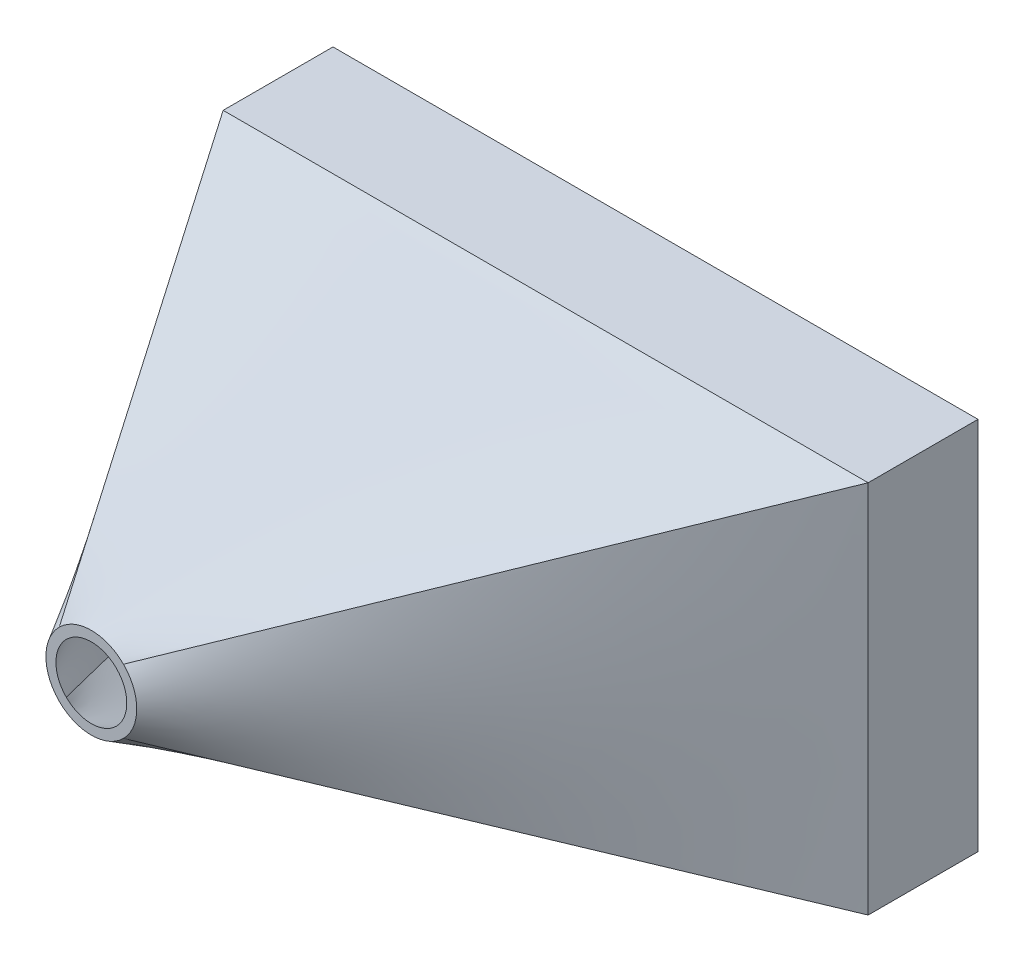
ISO-10303-21;
HEADER;
FILE_DESCRIPTION(('STEP AP214'),'2;1');
FILE_NAME('part.step','',(''),(''),'','','');
FILE_SCHEMA(('AUTOMOTIVE_DESIGN { 1 0 10303 214 1 1 1 1 }'));
ENDSEC;
DATA;
#1=APPLICATION_CONTEXT('core data for automotive mechanical design processes');
#2=APPLICATION_PROTOCOL_DEFINITION('international standard','automotive_design',2000,#1);
#3=PRODUCT_CONTEXT('',#1,'mechanical');
#4=PRODUCT('Part','Part','',(#3));
#5=PRODUCT_RELATED_PRODUCT_CATEGORY('part','',(#4));
#6=PRODUCT_DEFINITION_FORMATION('','',#4);
#7=PRODUCT_DEFINITION_CONTEXT('part definition',#1,'design');
#8=PRODUCT_DEFINITION('design','',#6,#7);
#9=PRODUCT_DEFINITION_SHAPE('','',#8);
#10=(LENGTH_UNIT() NAMED_UNIT(*) SI_UNIT(.MILLI.,.METRE.));
#11=(NAMED_UNIT(*) PLANE_ANGLE_UNIT() SI_UNIT($,.RADIAN.));
#12=(NAMED_UNIT(*) SI_UNIT($,.STERADIAN.) SOLID_ANGLE_UNIT());
#13=UNCERTAINTY_MEASURE_WITH_UNIT(LENGTH_MEASURE(1.E-05),#10,'distance_accuracy_value','');
#14=(GEOMETRIC_REPRESENTATION_CONTEXT(3) GLOBAL_UNCERTAINTY_ASSIGNED_CONTEXT((#13)) GLOBAL_UNIT_ASSIGNED_CONTEXT((#10,
#11,#12)) REPRESENTATION_CONTEXT('',''));
#15=CARTESIAN_POINT('',(0.,0.,0.));
#16=DIRECTION('',(0.,0.,1.));
#17=DIRECTION('',(1.,0.,0.));
#18=AXIS2_PLACEMENT_3D('',#15,#16,#17);
#19=CARTESIAN_POINT('',(-64.6,-37.5,22.));
#20=DIRECTION('',(0.,1.,0.));
#21=DIRECTION('',(0.,0.,1.));
#22=AXIS2_PLACEMENT_3D('',#19,#20,#21);
#23=PLANE('',#22);
#24=DIRECTION('',(1.,0.,0.));
#25=VECTOR('',#24,1.);
#26=CARTESIAN_POINT('',(-64.6,-37.5,0.));
#27=LINE('',#26,#25);
#28=CARTESIAN_POINT('',(-64.6,-37.5,0.));
#29=VERTEX_POINT('',#28);
#30=CARTESIAN_POINT('',(-62.6,-37.5,0.));
#31=VERTEX_POINT('',#30);
#32=EDGE_CURVE('E232',#29,#31,#27,.T.);
#33=ORIENTED_EDGE('',*,*,#32,.T.);
#34=DIRECTION('',(0.,0.,1.));
#35=VECTOR('',#34,1.);
#36=CARTESIAN_POINT('',(-62.6,-37.5,22.));
#37=LINE('',#36,#35);
#38=CARTESIAN_POINT('',(-62.6,-37.5,22.));
#39=VERTEX_POINT('',#38);
#40=EDGE_CURVE('E466',#31,#39,#37,.T.);
#41=ORIENTED_EDGE('',*,*,#40,.T.);
#42=DIRECTION('',(1.,0.,0.));
#43=VECTOR('',#42,1.);
#44=CARTESIAN_POINT('',(-64.6,-37.5,22.));
#45=LINE('',#44,#43);
#46=CARTESIAN_POINT('',(-64.6,-37.5,22.));
#47=VERTEX_POINT('',#46);
#48=EDGE_CURVE('E324',#47,#39,#45,.T.);
#49=ORIENTED_EDGE('',*,*,#48,.F.);
#50=DIRECTION('',(0.,0.,-1.));
#51=VECTOR('',#50,1.);
#52=CARTESIAN_POINT('',(-64.6,-37.5,22.));
#53=LINE('',#52,#51);
#54=EDGE_CURVE('E228',#47,#29,#53,.T.);
#55=ORIENTED_EDGE('',*,*,#54,.T.);
#56=EDGE_LOOP('',(#33,#41,#49,#55));
#57=FACE_BOUND('',#56,.T.);
#58=ADVANCED_FACE('F111',(#57),#23,.F.);
#59=CARTESIAN_POINT('',(0.,0.,0.));
#60=DIRECTION('',(0.,0.,1.));
#61=DIRECTION('',(1.,0.,0.));
#62=AXIS2_PLACEMENT_3D('',#59,#60,#61);
#63=PLANE('',#62);
#64=DIRECTION('',(0.,-1.,0.));
#65=VECTOR('',#64,1.);
#66=CARTESIAN_POINT('',(-62.6,35.5,0.));
#67=LINE('',#66,#65);
#68=CARTESIAN_POINT('',(-62.6,35.5,0.));
#69=VERTEX_POINT('',#68);
#70=EDGE_CURVE('E173',#69,#31,#67,.T.);
#71=ORIENTED_EDGE('',*,*,#70,.T.);
#72=ORIENTED_EDGE('',*,*,#32,.F.);
#73=DIRECTION('',(0.,-1.,0.));
#74=VECTOR('',#73,1.);
#75=CARTESIAN_POINT('',(-64.6,37.5,0.));
#76=LINE('',#75,#74);
#77=CARTESIAN_POINT('',(-64.6,37.5,0.));
#78=VERTEX_POINT('',#77);
#79=EDGE_CURVE('E219',#78,#29,#76,.T.);
#80=ORIENTED_EDGE('',*,*,#79,.F.);
#81=DIRECTION('',(-1.,0.,0.));
#82=VECTOR('',#81,1.);
#83=CARTESIAN_POINT('',(-64.6,37.5,0.));
#84=LINE('',#83,#82);
#85=CARTESIAN_POINT('',(64.6,37.5,0.));
#86=VERTEX_POINT('',#85);
#87=EDGE_CURVE('E210',#86,#78,#84,.T.);
#88=ORIENTED_EDGE('',*,*,#87,.F.);
#89=DIRECTION('',(0.,1.,0.));
#90=VECTOR('',#89,1.);
#91=CARTESIAN_POINT('',(64.6,37.5,0.));
#92=LINE('',#91,#90);
#93=CARTESIAN_POINT('',(64.6,-37.5,0.));
#94=VERTEX_POINT('',#93);
#95=EDGE_CURVE('E220',#94,#86,#92,.T.);
#96=ORIENTED_EDGE('',*,*,#95,.F.);
#97=CARTESIAN_POINT('',(62.6,-37.5,0.));
#98=VERTEX_POINT('',#97);
#99=EDGE_CURVE('E130',#98,#94,#27,.T.);
#100=ORIENTED_EDGE('',*,*,#99,.F.);
#101=DIRECTION('',(0.,1.,0.));
#102=VECTOR('',#101,1.);
#103=CARTESIAN_POINT('',(62.6,35.5,0.));
#104=LINE('',#103,#102);
#105=CARTESIAN_POINT('',(62.6,35.5,0.));
#106=VERTEX_POINT('',#105);
#107=EDGE_CURVE('E494',#98,#106,#104,.T.);
#108=ORIENTED_EDGE('',*,*,#107,.T.);
#109=DIRECTION('',(-1.,0.,0.));
#110=VECTOR('',#109,1.);
#111=CARTESIAN_POINT('',(-62.6,35.5,0.));
#112=LINE('',#111,#110);
#113=EDGE_CURVE('E493',#106,#69,#112,.T.);
#114=ORIENTED_EDGE('',*,*,#113,.T.);
#115=EDGE_LOOP('',(#71,#72,#80,#88,#96,#100,#108,#114));
#116=FACE_BOUND('',#115,.T.);
#117=ADVANCED_FACE('F230',(#116),#63,.F.);
#118=CARTESIAN_POINT('',(64.6,37.5,22.));
#119=DIRECTION('',(-1.,0.,0.));
#120=DIRECTION('',(0.,0.,1.));
#121=AXIS2_PLACEMENT_3D('',#118,#119,#120);
#122=PLANE('',#121);
#123=ORIENTED_EDGE('',*,*,#95,.T.);
#124=DIRECTION('',(0.,0.,-1.));
#125=VECTOR('',#124,1.);
#126=CARTESIAN_POINT('',(64.6,37.5,22.));
#127=LINE('',#126,#125);
#128=CARTESIAN_POINT('',(64.6,37.5,22.));
#129=VERTEX_POINT('',#128);
#130=EDGE_CURVE('E12',#129,#86,#127,.T.);
#131=ORIENTED_EDGE('',*,*,#130,.F.);
#132=DIRECTION('',(0.,1.,0.));
#133=VECTOR('',#132,1.);
#134=CARTESIAN_POINT('',(64.6,37.5,22.));
#135=LINE('',#134,#133);
#136=CARTESIAN_POINT('',(64.6,-37.5,22.));
#137=VERTEX_POINT('',#136);
#138=EDGE_CURVE('E163',#137,#129,#135,.T.);
#139=ORIENTED_EDGE('',*,*,#138,.F.);
#140=DIRECTION('',(0.,0.,-1.));
#141=VECTOR('',#140,1.);
#142=CARTESIAN_POINT('',(64.6,-37.5,22.));
#143=LINE('',#142,#141);
#144=EDGE_CURVE('E403',#137,#94,#143,.T.);
#145=ORIENTED_EDGE('',*,*,#144,.T.);
#146=EDGE_LOOP('',(#123,#131,#139,#145));
#147=FACE_BOUND('',#146,.T.);
#148=ADVANCED_FACE('F113',(#147),#122,.F.);
#149=CARTESIAN_POINT('',(-64.6,37.5,22.));
#150=DIRECTION('',(0.,-1.,0.));
#151=DIRECTION('',(0.,0.,-1.));
#152=AXIS2_PLACEMENT_3D('',#149,#150,#151);
#153=PLANE('',#152);
#154=ORIENTED_EDGE('',*,*,#87,.T.);
#155=DIRECTION('',(0.,0.,-1.));
#156=VECTOR('',#155,1.);
#157=CARTESIAN_POINT('',(-64.6,37.5,22.));
#158=LINE('',#157,#156);
#159=CARTESIAN_POINT('',(-64.6,37.5,22.));
#160=VERTEX_POINT('',#159);
#161=EDGE_CURVE('E121',#160,#78,#158,.T.);
#162=ORIENTED_EDGE('',*,*,#161,.F.);
#163=DIRECTION('',(1.,0.,0.));
#164=VECTOR('',#163,1.);
#165=CARTESIAN_POINT('',(-64.6,37.5,22.));
#166=LINE('',#165,#164);
#167=EDGE_CURVE('E237',#129,#160,#166,.F.);
#168=ORIENTED_EDGE('',*,*,#167,.F.);
#169=ORIENTED_EDGE('',*,*,#130,.T.);
#170=EDGE_LOOP('',(#154,#162,#168,#169));
#171=FACE_BOUND('',#170,.T.);
#172=ADVANCED_FACE('F212',(#171),#153,.F.);
#173=CARTESIAN_POINT('',(-64.6,37.5,22.));
#174=DIRECTION('',(1.,0.,0.));
#175=DIRECTION('',(0.,1.,0.));
#176=AXIS2_PLACEMENT_3D('',#173,#174,#175);
#177=PLANE('',#176);
#178=ORIENTED_EDGE('',*,*,#79,.T.);
#179=ORIENTED_EDGE('',*,*,#54,.F.);
#180=DIRECTION('',(0.,1.,0.));
#181=VECTOR('',#180,1.);
#182=CARTESIAN_POINT('',(-64.6,37.5,22.));
#183=LINE('',#182,#181);
#184=EDGE_CURVE('E227',#160,#47,#183,.F.);
#185=ORIENTED_EDGE('',*,*,#184,.F.);
#186=ORIENTED_EDGE('',*,*,#161,.T.);
#187=EDGE_LOOP('',(#178,#179,#185,#186));
#188=FACE_BOUND('',#187,.T.);
#189=ADVANCED_FACE('F223',(#188),#177,.F.);
#190=CARTESIAN_POINT('',(62.6,-37.5,22.));
#191=VERTEX_POINT('',#190);
#192=EDGE_CURVE('E402',#191,#137,#45,.T.);
#193=ORIENTED_EDGE('',*,*,#192,.F.);
#194=DIRECTION('',(0.,0.,-1.));
#195=VECTOR('',#194,1.);
#196=CARTESIAN_POINT('',(62.6,-37.5,22.));
#197=LINE('',#196,#195);
#198=EDGE_CURVE('E502',#191,#98,#197,.T.);
#199=ORIENTED_EDGE('',*,*,#198,.T.);
#200=ORIENTED_EDGE('',*,*,#99,.T.);
#201=ORIENTED_EDGE('',*,*,#144,.F.);
#202=EDGE_LOOP('',(#193,#199,#200,#201));
#203=FACE_BOUND('',#202,.T.);
#204=ADVANCED_FACE('F490',(#203),#23,.F.);
#205=CARTESIAN_POINT('',(62.6,35.5,22.));
#206=DIRECTION('',(-1.,0.,0.));
#207=DIRECTION('',(0.,0.,1.));
#208=AXIS2_PLACEMENT_3D('',#205,#206,#207);
#209=PLANE('',#208);
#210=ORIENTED_EDGE('',*,*,#107,.F.);
#211=ORIENTED_EDGE('',*,*,#198,.F.);
#212=DIRECTION('',(0.,1.,0.));
#213=VECTOR('',#212,1.);
#214=CARTESIAN_POINT('',(62.6,-45.5,22.));
#215=LINE('',#214,#213);
#216=CARTESIAN_POINT('',(62.6,-35.5,22.));
#217=VERTEX_POINT('',#216);
#218=EDGE_CURVE('E568',#191,#217,#215,.T.);
#219=ORIENTED_EDGE('',*,*,#218,.T.);
#220=DIRECTION('',(0.,1.,0.));
#221=VECTOR('',#220,1.);
#222=CARTESIAN_POINT('',(62.6,35.5,22.));
#223=LINE('',#222,#221);
#224=CARTESIAN_POINT('',(62.6,35.5,22.));
#225=VERTEX_POINT('',#224);
#226=EDGE_CURVE('E115',#217,#225,#223,.T.);
#227=ORIENTED_EDGE('',*,*,#226,.T.);
#228=DIRECTION('',(0.,0.,-1.));
#229=VECTOR('',#228,1.);
#230=CARTESIAN_POINT('',(62.6,35.5,22.));
#231=LINE('',#230,#229);
#232=EDGE_CURVE('E241',#225,#106,#231,.T.);
#233=ORIENTED_EDGE('',*,*,#232,.T.);
#234=EDGE_LOOP('',(#210,#211,#219,#227,#233));
#235=FACE_BOUND('',#234,.T.);
#236=ADVANCED_FACE('F569',(#235),#209,.T.);
#237=CARTESIAN_POINT('',(-62.6,35.5,22.));
#238=DIRECTION('',(0.,-1.,0.));
#239=DIRECTION('',(0.,0.,-1.));
#240=AXIS2_PLACEMENT_3D('',#237,#238,#239);
#241=PLANE('',#240);
#242=ORIENTED_EDGE('',*,*,#113,.F.);
#243=ORIENTED_EDGE('',*,*,#232,.F.);
#244=DIRECTION('',(1.,0.,0.));
#245=VECTOR('',#244,1.);
#246=CARTESIAN_POINT('',(-62.6,35.5,22.));
#247=LINE('',#246,#245);
#248=CARTESIAN_POINT('',(-62.6,35.5,22.));
#249=VERTEX_POINT('',#248);
#250=EDGE_CURVE('E460',#225,#249,#247,.F.);
#251=ORIENTED_EDGE('',*,*,#250,.T.);
#252=DIRECTION('',(0.,0.,-1.));
#253=VECTOR('',#252,1.);
#254=CARTESIAN_POINT('',(-62.6,35.5,22.));
#255=LINE('',#254,#253);
#256=EDGE_CURVE('E240',#249,#69,#255,.T.);
#257=ORIENTED_EDGE('',*,*,#256,.T.);
#258=EDGE_LOOP('',(#242,#243,#251,#257));
#259=FACE_BOUND('',#258,.T.);
#260=ADVANCED_FACE('F576',(#259),#241,.T.);
#261=CARTESIAN_POINT('',(-62.6,35.5,22.));
#262=DIRECTION('',(1.,0.,0.));
#263=DIRECTION('',(0.,1.,0.));
#264=AXIS2_PLACEMENT_3D('',#261,#262,#263);
#265=PLANE('',#264);
#266=ORIENTED_EDGE('',*,*,#70,.F.);
#267=ORIENTED_EDGE('',*,*,#256,.F.);
#268=DIRECTION('',(0.,1.,0.));
#269=VECTOR('',#268,1.);
#270=CARTESIAN_POINT('',(-62.6,35.5,22.));
#271=LINE('',#270,#269);
#272=CARTESIAN_POINT('',(-62.6,-35.5,22.));
#273=VERTEX_POINT('',#272);
#274=EDGE_CURVE('E318',#249,#273,#271,.F.);
#275=ORIENTED_EDGE('',*,*,#274,.T.);
#276=DIRECTION('',(0.,1.,0.));
#277=VECTOR('',#276,1.);
#278=CARTESIAN_POINT('',(-62.6,-45.5,22.));
#279=LINE('',#278,#277);
#280=EDGE_CURVE('E571',#39,#273,#279,.T.);
#281=ORIENTED_EDGE('',*,*,#280,.F.);
#282=ORIENTED_EDGE('',*,*,#40,.F.);
#283=EDGE_LOOP('',(#266,#267,#275,#281,#282));
#284=FACE_BOUND('',#283,.T.);
#285=ADVANCED_FACE('F269',(#284),#265,.T.);
#286=CARTESIAN_POINT('',(-17.,-1.,96.));
#287=DIRECTION('',(0.,0.,1.));
#288=DIRECTION('',(1.,0.,0.));
#289=AXIS2_PLACEMENT_3D('',#286,#287,#288);
#290=PLANE('',#289);
#291=CARTESIAN_POINT('',(-17.,-1.,96.));
#292=DIRECTION('',(0.,0.,1.));
#293=DIRECTION('',(1.,0.,0.));
#294=AXIS2_PLACEMENT_3D('',#291,#292,#293);
#295=CIRCLE('',#294,9.10000000003909);
#296=CARTESIAN_POINT('',(-10.5653282911529,-7.43467170884706,96.));
#297=VERTEX_POINT('',#296);
#298=CARTESIAN_POINT('',(-10.5653282911899,5.43467170884032,96.));
#299=VERTEX_POINT('',#298);
#300=EDGE_CURVE('E465',#297,#299,#295,.T.);
#301=ORIENTED_EDGE('',*,*,#300,.T.);
#302=CARTESIAN_POINT('',(-17.,-1.,96.));
#303=DIRECTION('',(0.,0.,1.));
#304=DIRECTION('',(1.,0.,0.));
#305=AXIS2_PLACEMENT_3D('',#302,#303,#304);
#306=CIRCLE('',#305,9.09999999996391);
#307=CARTESIAN_POINT('',(-23.4346717088471,5.43467170884706,96.));
#308=VERTEX_POINT('',#307);
#309=EDGE_CURVE('E423',#299,#308,#306,.T.);
#310=ORIENTED_EDGE('',*,*,#309,.T.);
#311=CARTESIAN_POINT('',(-17.,-1.,96.));
#312=DIRECTION('',(0.,0.,1.));
#313=DIRECTION('',(-1.,0.,0.));
#314=AXIS2_PLACEMENT_3D('',#311,#312,#313);
#315=CIRCLE('',#314,9.10000000006997);
#316=CARTESIAN_POINT('',(-23.4346717088266,-7.43467170886753,96.));
#317=VERTEX_POINT('',#316);
#318=EDGE_CURVE('E341',#308,#317,#315,.T.);
#319=ORIENTED_EDGE('',*,*,#318,.T.);
#320=CARTESIAN_POINT('',(-17.,-1.,96.));
#321=DIRECTION('',(0.,0.,1.));
#322=DIRECTION('',(1.,0.,0.));
#323=AXIS2_PLACEMENT_3D('',#320,#321,#322);
#324=CIRCLE('',#323,9.10000000006997);
#325=EDGE_CURVE('E319',#317,#297,#324,.T.);
#326=ORIENTED_EDGE('',*,*,#325,.T.);
#327=EDGE_LOOP('',(#301,#310,#319,#326));
#328=FACE_BOUND('',#327,.T.);
#329=CARTESIAN_POINT('',(-17.,-1.,96.));
#330=DIRECTION('',(0.,0.,-1.));
#331=DIRECTION('',(1.,0.,0.));
#332=AXIS2_PLACEMENT_3D('',#329,#330,#331);
#333=CIRCLE('',#332,7.09999999993093);
#334=CARTESIAN_POINT('',(-22.0204581464245,4.02045814642449,96.));
#335=VERTEX_POINT('',#334);
#336=CARTESIAN_POINT('',(-11.9795418536394,4.02045814639074,96.));
#337=VERTEX_POINT('',#336);
#338=EDGE_CURVE('E420',#335,#337,#333,.T.);
#339=ORIENTED_EDGE('',*,*,#338,.T.);
#340=CARTESIAN_POINT('',(-17.,-1.,96.));
#341=DIRECTION('',(0.,0.,-1.));
#342=DIRECTION('',(1.,0.,0.));
#343=AXIS2_PLACEMENT_3D('',#340,#341,#342);
#344=CIRCLE('',#343,7.09999999998014);
#345=CARTESIAN_POINT('',(-11.9795418535565,-6.02045814644693,96.));
#346=VERTEX_POINT('',#345);
#347=EDGE_CURVE('E406',#337,#346,#344,.T.);
#348=ORIENTED_EDGE('',*,*,#347,.T.);
#349=CARTESIAN_POINT('',(-17.,-1.,96.));
#350=DIRECTION('',(0.,0.,-1.));
#351=DIRECTION('',(1.,0.,0.));
#352=AXIS2_PLACEMENT_3D('',#349,#350,#351);
#353=CIRCLE('',#352,7.10000000003904);
#354=CARTESIAN_POINT('',(-22.0204581464337,-6.02045814647048,96.));
#355=VERTEX_POINT('',#354);
#356=EDGE_CURVE('E323',#346,#355,#353,.T.);
#357=ORIENTED_EDGE('',*,*,#356,.T.);
#358=CARTESIAN_POINT('',(-17.,-1.,96.));
#359=DIRECTION('',(0.,0.,-1.));
#360=DIRECTION('',(1.,0.,0.));
#361=AXIS2_PLACEMENT_3D('',#358,#359,#360);
#362=CIRCLE('',#361,7.1);
#363=EDGE_CURVE('E250',#355,#335,#362,.T.);
#364=ORIENTED_EDGE('',*,*,#363,.T.);
#365=EDGE_LOOP('',(#339,#348,#357,#364));
#366=FACE_BOUND('',#365,.T.);
#367=ADVANCED_FACE('F258',(#328,#366),#290,.T.);
#368=CARTESIAN_POINT('',(-62.6,35.5,22.));
#369=CARTESIAN_POINT('',(-22.0204581463756,4.02045814637565,96.));
#370=CARTESIAN_POINT('',(-57.3833333333333,35.5,22.));
#371=CARTESIAN_POINT('',(-21.7246248130456,4.31629147970566,96.));
#372=CARTESIAN_POINT('',(-52.1666666666667,35.5,22.));
#373=CARTESIAN_POINT('',(-21.3914294559345,4.59688903036113,96.));
#374=CARTESIAN_POINT('',(-41.7333333333334,35.5,22.));
#375=CARTESIAN_POINT('',(-20.6547816609089,5.10347364176412,96.));
#376=CARTESIAN_POINT('',(-36.5166666666667,35.5,22.));
#377=CARTESIAN_POINT('',(-20.2512916042196,5.32929668338113,96.));
#378=CARTESIAN_POINT('',(-26.0833333333334,35.5,22.));
#379=CARTESIAN_POINT('',(-19.3886267302209,5.70263798407781,96.));
#380=CARTESIAN_POINT('',(-20.8666666666667,35.5,22.));
#381=CARTESIAN_POINT('',(-18.929519451681,5.84997325082757,96.));
#382=CARTESIAN_POINT('',(-10.4333333333334,35.5,22.));
#383=CARTESIAN_POINT('',(-17.9801950855716,6.04871594304167,96.));
#384=CARTESIAN_POINT('',(-5.2166666666667,35.5,22.));
#385=CARTESIAN_POINT('',(-17.4901527154797,6.09999999993019,96.));
#386=CARTESIAN_POINT('',(5.21666666666662,35.5,22.));
#387=CARTESIAN_POINT('',(-16.5098472845416,6.09999999993167,96.));
#388=CARTESIAN_POINT('',(10.4333333333333,35.5,22.));
#389=CARTESIAN_POINT('',(-16.0198049144496,6.04871594304462,96.));
#390=CARTESIAN_POINT('',(20.8666666666666,35.5,22.));
#391=CARTESIAN_POINT('',(-15.0704805483396,5.84997325083337,96.));
#392=CARTESIAN_POINT('',(26.0833333333332,35.5,22.));
#393=CARTESIAN_POINT('',(-14.6113732697993,5.702637984085,96.));
#394=CARTESIAN_POINT('',(36.5166666666666,35.5,22.));
#395=CARTESIAN_POINT('',(-13.7487083957994,5.32929668339091,96.));
#396=CARTESIAN_POINT('',(41.7333333333333,35.5,22.));
#397=CARTESIAN_POINT('',(-13.3452183391094,5.10347364177511,96.));
#398=CARTESIAN_POINT('',(52.1666666666666,35.5,22.));
#399=CARTESIAN_POINT('',(-12.6085705440823,4.59688903037433,96.));
#400=CARTESIAN_POINT('',(57.3833333333333,35.5,22.));
#401=CARTESIAN_POINT('',(-12.2753751869703,4.31629147971986,96.));
#402=CARTESIAN_POINT('',(62.6,35.5,22.));
#403=CARTESIAN_POINT('',(-11.9795418536394,4.02045814639073,96.));
#404=B_SPLINE_SURFACE_WITH_KNOTS('',3,1,((#368,#369),(#370,#371),(#372,#373),(#374,#375),(#376,
#377),(#378,#379),(#380,#381),(#382,#383),(#384,#385),(#386,#387),(#388,#389),(#390,#391),(#392,
#393),(#394,#395),(#396,#397),(#398,#399),(#400,#401),(#402,#403)),.UNSPECIFIED.,.F.,.F.,.F.,(4,
2,2,2,2,2,2,2,4),(2,2),(0.,0.125,0.25,0.375,0.5,0.624999999999999,0.749999999999999,0.875,1.),
(0.,1.),.UNSPECIFIED.);
#405=DIRECTION('',(-0.679991825607433,-0.287020147915762,0.674707752880819));
#406=VECTOR('',#405,1.);
#407=CARTESIAN_POINT('',(62.6,35.5,22.));
#408=LINE('',#407,#406);
#409=EDGE_CURVE('E426',#225,#337,#408,.T.);
#410=DIRECTION('',(0.450504067453947,-0.349478111354722,0.821529752894797));
#411=VECTOR('',#410,1.);
#412=CARTESIAN_POINT('',(-62.6,35.5,22.));
#413=LINE('',#412,#411);
#414=EDGE_CURVE('E416',#249,#335,#413,.T.);
#415=ORIENTED_EDGE('',*,*,#250,.F.);
#416=ORIENTED_EDGE('',*,*,#409,.T.);
#417=ORIENTED_EDGE('',*,*,#338,.F.);
#418=ORIENTED_EDGE('',*,*,#414,.F.);
#419=EDGE_LOOP('',(#415,#416,#417,#418));
#420=FACE_BOUND('',#419,.T.);
#421=ADVANCED_FACE('F268',(#420),#404,.T.);
#422=CARTESIAN_POINT('',(64.6,37.5,22.));
#423=CARTESIAN_POINT('',(-10.5653282912253,5.43467170876941,96.));
#424=CARTESIAN_POINT('',(59.2166666666667,37.5,22.));
#425=CARTESIAN_POINT('',(-10.9444949578904,5.81383837543481,96.));
#426=CARTESIAN_POINT('',(53.8333333333334,37.5,22.));
#427=CARTESIAN_POINT('',(-11.3715481620782,6.17347748965806,96.));
#428=CARTESIAN_POINT('',(43.0666666666668,37.5,22.));
#429=CARTESIAN_POINT('',(-12.315702378245,6.82276199160222,96.));
#430=CARTESIAN_POINT('',(37.6833333333334,37.5,22.));
#431=CARTESIAN_POINT('',(-12.8328516058368,7.11219715762062,96.));
#432=CARTESIAN_POINT('',(26.9166666666668,37.5,22.));
#433=CARTESIAN_POINT('',(-13.9385206697034,7.59070502189728,96.));
#434=CARTESIAN_POINT('',(21.5333333333335,37.5,22.));
#435=CARTESIAN_POINT('',(-14.526953942203,7.77954318069043,96.));
#436=CARTESIAN_POINT('',(10.7666666666668,37.5,22.));
#437=CARTESIAN_POINT('',(-15.7436936227195,8.03426972986734,96.));
#438=CARTESIAN_POINT('',(5.3833333333335,37.5,22.));
#439=CARTESIAN_POINT('',(-16.3717760970679,8.09999999996378,96.));
#440=CARTESIAN_POINT('',(-5.38333333333316,37.5,22.));
#441=CARTESIAN_POINT('',(-17.6282239029283,8.09999999996404,96.));
#442=CARTESIAN_POINT('',(-10.7666666666665,37.5,22.));
#443=CARTESIAN_POINT('',(-18.2563063772767,8.03426972986786,96.));
#444=CARTESIAN_POINT('',(-21.5333333333332,37.5,22.));
#445=CARTESIAN_POINT('',(-19.4730460577934,7.77954318069145,96.));
#446=CARTESIAN_POINT('',(-26.9166666666665,37.5,22.));
#447=CARTESIAN_POINT('',(-20.0614793302931,7.59070502189854,96.));
#448=CARTESIAN_POINT('',(-37.6833333333332,37.5,22.));
#449=CARTESIAN_POINT('',(-21.1671483941598,7.11219715762234,96.));
#450=CARTESIAN_POINT('',(-43.0666666666666,37.5,22.));
#451=CARTESIAN_POINT('',(-21.6842976217518,6.82276199160415,96.));
#452=CARTESIAN_POINT('',(-53.8333333333333,37.5,22.));
#453=CARTESIAN_POINT('',(-22.6284518379188,6.17347748966038,96.));
#454=CARTESIAN_POINT('',(-59.2166666666666,37.5,22.));
#455=CARTESIAN_POINT('',(-23.0555050421068,5.8138383754373,96.));
#456=CARTESIAN_POINT('',(-64.6,37.5,22.));
#457=CARTESIAN_POINT('',(-23.4346717087721,5.43467170877206,96.));
#458=B_SPLINE_SURFACE_WITH_KNOTS('',3,1,((#422,#423),(#424,#425),(#426,#427),(#428,#429),(#430,
#431),(#432,#433),(#434,#435),(#436,#437),(#438,#439),(#440,#441),(#442,#443),(#444,#445),(#446,
#447),(#448,#449),(#450,#451),(#452,#453),(#454,#455),(#456,#457)),.UNSPECIFIED.,.F.,.F.,.F.,(4,
2,2,2,2,2,2,2,4),(2,2),(0.,0.125,0.25,0.375,0.5,0.625,0.75,0.875,1.),(0.,1.),.UNSPECIFIED.);
#459=DIRECTION('',(0.454629113901018,-0.354128884503337,0.817254612684442));
#460=VECTOR('',#459,1.);
#461=CARTESIAN_POINT('',(-44.017335854386,21.467335854386,59.));
#462=LINE('',#461,#460);
#463=EDGE_CURVE('E421',#160,#308,#462,.T.);
#464=DIRECTION('',(-0.681801152165622,-0.29085455050267,0.671230824200975));
#465=VECTOR('',#464,1.);
#466=CARTESIAN_POINT('',(64.6,37.5,22.));
#467=LINE('',#466,#465);
#468=EDGE_CURVE('E400',#129,#299,#467,.T.);
#469=ORIENTED_EDGE('',*,*,#167,.T.);
#470=ORIENTED_EDGE('',*,*,#463,.T.);
#471=ORIENTED_EDGE('',*,*,#309,.F.);
#472=ORIENTED_EDGE('',*,*,#468,.F.);
#473=EDGE_LOOP('',(#469,#470,#471,#472));
#474=FACE_BOUND('',#473,.T.);
#475=ADVANCED_FACE('F271',(#474),#458,.T.);
#476=CARTESIAN_POINT('',(-64.6,37.5,22.));
#477=CARTESIAN_POINT('',(-23.4346717088471,5.43467170884706,96.));
#478=CARTESIAN_POINT('',(-64.6,34.375,22.));
#479=CARTESIAN_POINT('',(-23.8138383755173,5.05550504217688,96.));
#480=CARTESIAN_POINT('',(-64.6,31.25,22.));
#481=CARTESIAN_POINT('',(-24.173477489745,4.62845183798319,96.));
#482=CARTESIAN_POINT('',(-64.6,25.,22.));
#483=CARTESIAN_POINT('',(-24.8227619916971,3.68429762180344,96.));
#484=CARTESIAN_POINT('',(-64.6,21.875,22.));
#485=CARTESIAN_POINT('',(-25.112197157719,3.16714839420446,96.));
#486=CARTESIAN_POINT('',(-64.6,15.625,22.));
#487=CARTESIAN_POINT('',(-25.590705022001,2.06147933032257,96.));
#488=CARTESIAN_POINT('',(-64.6,12.5,22.));
#489=CARTESIAN_POINT('',(-25.779543180796,1.4730460578147,96.));
#490=CARTESIAN_POINT('',(-64.6,6.25000000000001,22.));
#491=CARTESIAN_POINT('',(-26.0342697299746,0.256306377281342,96.));
#492=CARTESIAN_POINT('',(-64.6,3.12500000000001,22.));
#493=CARTESIAN_POINT('',(-26.100000000071,-0.371776097075703,96.));
#494=CARTESIAN_POINT('',(-64.6,-3.12499999999999,22.));
#495=CARTESIAN_POINT('',(-26.100000000069,-1.62822390295325,96.));
#496=CARTESIAN_POINT('',(-64.6,-6.24999999999999,22.));
#497=CARTESIAN_POINT('',(-26.0342697299706,-2.25630637731008,96.));
#498=CARTESIAN_POINT('',(-64.6,-12.5,22.));
#499=CARTESIAN_POINT('',(-25.7795431807881,-3.47304605784263,96.));
#500=CARTESIAN_POINT('',(-64.6,-15.625,22.));
#501=CARTESIAN_POINT('',(-25.5907050219912,-4.0614793303499,96.));
#502=CARTESIAN_POINT('',(-64.6,-21.875,22.));
#503=CARTESIAN_POINT('',(-25.1121971577057,-5.16714839423026,96.));
#504=CARTESIAN_POINT('',(-64.6,-25.,22.));
#505=CARTESIAN_POINT('',(-24.8227619916822,-5.68429762182833,96.));
#506=CARTESIAN_POINT('',(-64.6,-31.25,22.));
#507=CARTESIAN_POINT('',(-24.1734774897271,-6.62845183800601,96.));
#508=CARTESIAN_POINT('',(-64.6,-34.375,22.));
#509=CARTESIAN_POINT('',(-23.813838375498,-7.05550504219855,96.));
#510=CARTESIAN_POINT('',(-64.6,-37.5,22.));
#511=CARTESIAN_POINT('',(-23.4346717088266,-7.43467170886753,96.));
#512=B_SPLINE_SURFACE_WITH_KNOTS('',3,1,((#476,#477),(#478,#479),(#480,#481),(#482,#483),(#484,
#485),(#486,#487),(#488,#489),(#490,#491),(#492,#493),(#494,#495),(#496,#497),(#498,#499),(#500,
#501),(#502,#503),(#504,#505),(#506,#507),(#508,#509),(#510,#511)),.UNSPECIFIED.,.F.,.F.,.F.,(4,
2,2,2,2,2,2,2,4),(2,2),(0.,0.125,0.25,0.375,0.5,0.625,0.75,0.875,1.),(0.,1.),.UNSPECIFIED.);
#513=DIRECTION('',(0.458113977558624,0.334586111706287,0.823519105679209));
#514=VECTOR('',#513,1.);
#515=CARTESIAN_POINT('',(-64.6,-37.5,22.));
#516=LINE('',#515,#514);
#517=EDGE_CURVE('E331',#47,#317,#516,.T.);
#518=ORIENTED_EDGE('',*,*,#184,.T.);
#519=ORIENTED_EDGE('',*,*,#517,.T.);
#520=ORIENTED_EDGE('',*,*,#318,.F.);
#521=ORIENTED_EDGE('',*,*,#463,.F.);
#522=EDGE_LOOP('',(#518,#519,#520,#521));
#523=FACE_BOUND('',#522,.T.);
#524=ADVANCED_FACE('F348',(#523),#512,.T.);
#525=CARTESIAN_POINT('',(-62.6,-35.5,22.));
#526=CARTESIAN_POINT('',(-22.0204581464144,-6.02045814643454,96.));
#527=CARTESIAN_POINT('',(-62.6,-32.5416666666666,22.));
#528=CARTESIAN_POINT('',(-22.3162914797487,-5.7246248131015,96.));
#529=CARTESIAN_POINT('',(-62.6,-29.5833333333333,22.));
#530=CARTESIAN_POINT('',(-22.5968890304082,-5.3914294559867,96.));
#531=CARTESIAN_POINT('',(-62.6,-23.6666666666666,22.));
#532=CARTESIAN_POINT('',(-23.1034736418187,-4.6547816609526,96.));
#533=CARTESIAN_POINT('',(-62.6,-20.7083333333332,22.));
#534=CARTESIAN_POINT('',(-23.3292966834392,-4.25129160425838,96.));
#535=CARTESIAN_POINT('',(-62.6,-14.7916666666666,22.));
#536=CARTESIAN_POINT('',(-23.7026379841415,-3.38862673024879,96.));
#537=CARTESIAN_POINT('',(-62.6,-11.8333333333332,22.));
#538=CARTESIAN_POINT('',(-23.8499732508934,-2.92951945170294,96.));
#539=CARTESIAN_POINT('',(-62.6,-5.91666666666653,22.));
#540=CARTESIAN_POINT('',(-24.0487159431104,-1.98019508558107,96.));
#541=CARTESIAN_POINT('',(-62.6,-2.95833333333319,22.));
#542=CARTESIAN_POINT('',(-24.0999999999995,-1.49015271548263,96.));
#543=CARTESIAN_POINT('',(-62.6,2.95833333333347,22.));
#544=CARTESIAN_POINT('',(-24.1000000000005,-0.509847284531583,96.));
#545=CARTESIAN_POINT('',(-62.6,5.9166666666668,22.));
#546=CARTESIAN_POINT('',(-24.0487159431123,-0.0198049144330414,96.));
#547=CARTESIAN_POINT('',(-62.6,11.8333333333335,22.));
#548=CARTESIAN_POINT('',(-23.8499732508973,0.929519451689226,96.));
#549=CARTESIAN_POINT('',(-62.6,14.7916666666668,22.));
#550=CARTESIAN_POINT('',(-23.7026379841462,1.38862673023537,96.));
#551=CARTESIAN_POINT('',(-62.6,20.7083333333334,22.));
#552=CARTESIAN_POINT('',(-23.3292966834457,2.25129160424571,96.));
#553=CARTESIAN_POINT('',(-62.6,23.6666666666667,22.));
#554=CARTESIAN_POINT('',(-23.1034736418261,2.65478166094038,96.));
#555=CARTESIAN_POINT('',(-62.6,29.5833333333334,22.));
#556=CARTESIAN_POINT('',(-22.596889030417,3.39142945597549,96.));
#557=CARTESIAN_POINT('',(-62.6,32.5416666666667,22.));
#558=CARTESIAN_POINT('',(-22.3162914797581,3.72462481309086,96.));
#559=CARTESIAN_POINT('',(-62.6,35.5,22.));
#560=CARTESIAN_POINT('',(-22.0204581464245,4.02045814642449,96.));
#561=B_SPLINE_SURFACE_WITH_KNOTS('',3,1,((#525,#526),(#527,#528),(#529,#530),(#531,#532),(#533,
#534),(#535,#536),(#537,#538),(#539,#540),(#541,#542),(#543,#544),(#545,#546),(#547,#548),(#549,
#550),(#551,#552),(#553,#554),(#555,#556),(#557,#558),(#559,#560)),.UNSPECIFIED.,.F.,.F.,.F.,(4,
2,2,2,2,2,2,2,4),(2,2),(0.,0.125,0.25,0.375,0.5,0.625,0.75,0.875,1.),(0.,1.),.UNSPECIFIED.);
#562=DIRECTION('',(0.453927396999427,0.32976152728896,0.827772464734952));
#563=VECTOR('',#562,1.);
#564=CARTESIAN_POINT('',(-62.6,-35.5,22.));
#565=LINE('',#564,#563);
#566=EDGE_CURVE('E322',#273,#355,#565,.T.);
#567=ORIENTED_EDGE('',*,*,#274,.F.);
#568=ORIENTED_EDGE('',*,*,#414,.T.);
#569=ORIENTED_EDGE('',*,*,#363,.F.);
#570=ORIENTED_EDGE('',*,*,#566,.F.);
#571=EDGE_LOOP('',(#567,#568,#569,#570));
#572=FACE_BOUND('',#571,.T.);
#573=ADVANCED_FACE('F360',(#572),#561,.T.);
#574=CARTESIAN_POINT('',(-64.6,-37.5,22.));
#575=CARTESIAN_POINT('',(-23.4346717088266,-7.43467170886753,96.));
#576=CARTESIAN_POINT('',(-59.2166666666666,-37.5,22.));
#577=CARTESIAN_POINT('',(-23.0555050421564,-7.8138383755353,96.));
#578=CARTESIAN_POINT('',(-53.8333333333333,-37.5,22.));
#579=CARTESIAN_POINT('',(-22.6284518379632,-8.17347748976057,96.));
#580=CARTESIAN_POINT('',(-43.0666666666667,-37.5,22.));
#581=CARTESIAN_POINT('',(-21.6842976217853,-8.82276199170788,96.));
#582=CARTESIAN_POINT('',(-37.6833333333333,-37.5,22.));
#583=CARTESIAN_POINT('',(-21.1671483941877,-9.11219715772742,96.));
#584=CARTESIAN_POINT('',(-26.9166666666667,-37.5,22.));
#585=CARTESIAN_POINT('',(-20.0614793303095,-9.59070502200544,96.));
#586=CARTESIAN_POINT('',(-21.5333333333334,-37.5,22.));
#587=CARTESIAN_POINT('',(-19.4730460578039,-9.7795431807988,96.));
#588=CARTESIAN_POINT('',(-10.7666666666667,-37.5,22.));
#589=CARTESIAN_POINT('',(-18.2563063772757,-10.0342697299752,96.));
#590=CARTESIAN_POINT('',(-5.38333333333335,-37.5,22.));
#591=CARTESIAN_POINT('',(-17.6282239029215,-10.100000000071,96.));
#592=CARTESIAN_POINT('',(5.38333333333329,-37.5,22.));
#593=CARTESIAN_POINT('',(-16.3717760970496,-10.100000000069,96.));
#594=CARTESIAN_POINT('',(10.7666666666666,-37.5,22.));
#595=CARTESIAN_POINT('',(-15.7436936226956,-10.0342697299712,96.));
#596=CARTESIAN_POINT('',(21.5333333333332,-37.5,22.));
#597=CARTESIAN_POINT('',(-14.5269539421681,-9.77954318079094,96.));
#598=CARTESIAN_POINT('',(26.9166666666666,-37.5,22.));
#599=CARTESIAN_POINT('',(-13.9385206696632,-9.5907050219957,96.));
#600=CARTESIAN_POINT('',(37.6833333333333,-37.5,22.));
#601=CARTESIAN_POINT('',(-12.8328516057865,-9.11219715771417,96.));
#602=CARTESIAN_POINT('',(43.0666666666666,-37.5,22.));
#603=CARTESIAN_POINT('',(-12.3157023781899,-8.82276199169298,96.));
#604=CARTESIAN_POINT('',(53.8333333333333,-37.5,22.));
#605=CARTESIAN_POINT('',(-11.371548162014,-8.17347748974266,96.));
#606=CARTESIAN_POINT('',(59.2166666666666,-37.5,22.));
#607=CARTESIAN_POINT('',(-10.9444949578219,-7.81383837551604,96.));
#608=CARTESIAN_POINT('',(64.5999999999999,-37.5,22.));
#609=CARTESIAN_POINT('',(-10.5653282911529,-7.43467170884706,96.));
#610=B_SPLINE_SURFACE_WITH_KNOTS('',3,1,((#574,#575),(#576,#577),(#578,#579),(#580,#581),(#582,
#583),(#584,#585),(#586,#587),(#588,#589),(#590,#591),(#592,#593),(#594,#595),(#596,#597),(#598,
#599),(#600,#601),(#602,#603),(#604,#605),(#606,#607),(#608,#609)),.UNSPECIFIED.,.F.,.F.,.F.,(4,
2,2,2,2,2,2,2,4),(2,2),(0.,0.125,0.25,0.375,0.5,0.624999999999999,0.75,0.875,1.),(0.,1.),.UNSPECIFIED.);
#611=DIRECTION('',(1.,0.,0.));
#612=VECTOR('',#611,1.);
#613=CARTESIAN_POINT('',(0.,-37.5,22.));
#614=LINE('',#613,#612);
#615=EDGE_CURVE('E487',#191,#39,#614,.F.);
#616=DIRECTION('',(-0.685313438068348,0.274118053712921,0.674688657257242));
#617=VECTOR('',#616,1.);
#618=CARTESIAN_POINT('',(64.6,-37.5,22.));
#619=LINE('',#618,#617);
#620=EDGE_CURVE('E411',#137,#297,#619,.T.);
#621=ORIENTED_EDGE('',*,*,#48,.T.);
#622=ORIENTED_EDGE('',*,*,#615,.F.);
#623=ORIENTED_EDGE('',*,*,#192,.T.);
#624=ORIENTED_EDGE('',*,*,#620,.T.);
#625=ORIENTED_EDGE('',*,*,#325,.F.);
#626=ORIENTED_EDGE('',*,*,#517,.F.);
#627=EDGE_LOOP('',(#621,#622,#623,#624,#625,#626));
#628=FACE_BOUND('',#627,.T.);
#629=ADVANCED_FACE('F375',(#628),#610,.T.);
#630=CARTESIAN_POINT('',(62.6,-35.5,22.));
#631=CARTESIAN_POINT('',(-11.97954185355,-6.02045814645418,96.));
#632=CARTESIAN_POINT('',(57.3833333333333,-35.5,22.));
#633=CARTESIAN_POINT('',(-12.2753751868845,-6.31629147978841,96.));
#634=CARTESIAN_POINT('',(52.1666666666666,-35.5,22.));
#635=CARTESIAN_POINT('',(-12.6085705440006,-6.59688903044787,96.));
#636=CARTESIAN_POINT('',(41.7333333333332,-35.5,22.));
#637=CARTESIAN_POINT('',(-13.3452183390371,-7.10347364185804,96.));
#638=CARTESIAN_POINT('',(36.5166666666665,-35.5,22.));
#639=CARTESIAN_POINT('',(-13.7487083957323,-7.32929668347823,96.));
#640=CARTESIAN_POINT('',(26.0833333333332,-35.5,22.));
#641=CARTESIAN_POINT('',(-14.6113732697436,-7.70263798418018,96.));
#642=CARTESIAN_POINT('',(20.8666666666665,-35.5,22.));
#643=CARTESIAN_POINT('',(-15.0704805482902,-7.84997325093202,96.));
#644=CARTESIAN_POINT('',(10.4333333333331,-35.5,22.));
#645=CARTESIAN_POINT('',(-16.0198049144134,-8.04871594314897,96.));
#646=CARTESIAN_POINT('',(5.21666666666646,-35.5,22.));
#647=CARTESIAN_POINT('',(-16.5098472845124,-8.10000000003825,96.));
#648=CARTESIAN_POINT('',(-5.21666666666687,-35.5,22.));
#649=CARTESIAN_POINT('',(-17.4901527154646,-8.10000000003984,96.));
#650=CARTESIAN_POINT('',(-10.4333333333335,-35.5,22.));
#651=CARTESIAN_POINT('',(-17.9801950855638,-8.04871594315215,96.));
#652=CARTESIAN_POINT('',(-20.8666666666668,-35.5,22.));
#653=CARTESIAN_POINT('',(-18.9295194516875,-7.84997325093828,96.));
#654=CARTESIAN_POINT('',(-26.0833333333335,-35.5,22.));
#655=CARTESIAN_POINT('',(-19.3886267302346,-7.70263798418794,96.));
#656=CARTESIAN_POINT('',(-36.5166666666668,-35.5,22.));
#657=CARTESIAN_POINT('',(-20.2512916042472,-7.32929668348879,96.));
#658=CARTESIAN_POINT('',(-41.7333333333334,-35.5,22.));
#659=CARTESIAN_POINT('',(-20.6547816609431,-7.1034736418699,96.));
#660=CARTESIAN_POINT('',(-52.1666666666667,-35.5,22.));
#661=CARTESIAN_POINT('',(-21.3914294559812,-6.59688903046213,96.));
#662=CARTESIAN_POINT('',(-57.3833333333333,-35.5,22.));
#663=CARTESIAN_POINT('',(-21.7246248130983,-6.31629147980375,96.));
#664=CARTESIAN_POINT('',(-62.6,-35.5,22.));
#665=CARTESIAN_POINT('',(-22.0204581464337,-6.02045814647048,96.));
#666=B_SPLINE_SURFACE_WITH_KNOTS('',3,1,((#630,#631),(#632,#633),(#634,#635),(#636,#637),(#638,
#639),(#640,#641),(#642,#643),(#644,#645),(#646,#647),(#648,#649),(#650,#651),(#652,#653),(#654,
#655),(#656,#657),(#658,#659),(#660,#661),(#662,#663),(#664,#665)),.UNSPECIFIED.,.F.,.F.,.F.,(4,
2,2,2,2,2,2,2,4),(2,2),(0.,0.125,0.25,0.375,0.5,0.625,0.75,0.875,1.),(0.,1.),.UNSPECIFIED.);
#667=DIRECTION('',(1.,0.,0.));
#668=VECTOR('',#667,1.);
#669=CARTESIAN_POINT('',(-62.6,-35.5,22.));
#670=LINE('',#669,#668);
#671=EDGE_CURVE('E242',#273,#217,#670,.T.);
#672=DIRECTION('',(-0.683464202009156,0.270157352107281,0.678153146180397));
#673=VECTOR('',#672,1.);
#674=CARTESIAN_POINT('',(62.6,-35.5,22.));
#675=LINE('',#674,#673);
#676=EDGE_CURVE('E477',#217,#346,#675,.T.);
#677=ORIENTED_EDGE('',*,*,#671,.F.);
#678=ORIENTED_EDGE('',*,*,#566,.T.);
#679=ORIENTED_EDGE('',*,*,#356,.F.);
#680=ORIENTED_EDGE('',*,*,#676,.F.);
#681=EDGE_LOOP('',(#677,#678,#679,#680));
#682=FACE_BOUND('',#681,.T.);
#683=ADVANCED_FACE('F361',(#682),#666,.T.);
#684=CARTESIAN_POINT('',(62.6,35.5,22.));
#685=CARTESIAN_POINT('',(-11.9795418536047,4.02045814642553,96.));
#686=CARTESIAN_POINT('',(62.6,32.5416666666667,22.));
#687=CARTESIAN_POINT('',(-11.6837085202708,3.72462481309342,96.));
#688=CARTESIAN_POINT('',(62.6,29.5833333333333,22.));
#689=CARTESIAN_POINT('',(-11.4031109696115,3.39142945597958,96.));
#690=CARTESIAN_POINT('',(62.6,23.6666666666667,22.));
#691=CARTESIAN_POINT('',(-10.8965263582013,2.65478166094741,96.));
#692=CARTESIAN_POINT('',(62.6,20.7083333333333,22.));
#693=CARTESIAN_POINT('',(-10.670703316581,2.25129160425416,96.));
#694=CARTESIAN_POINT('',(62.6,14.7916666666667,22.));
#695=CARTESIAN_POINT('',(-10.2973620158788,1.38862673024649,96.));
#696=CARTESIAN_POINT('',(62.6,11.8333333333333,22.));
#697=CARTESIAN_POINT('',(-10.1500267491268,0.929519451701596,96.));
#698=CARTESIAN_POINT('',(62.6,5.91666666666667,22.));
#699=CARTESIAN_POINT('',(-9.95128405690978,-0.0198049144183949,96.));
#700=CARTESIAN_POINT('',(62.6,2.95833333333334,22.));
#701=CARTESIAN_POINT('',(-9.90000000002052,-0.509847284515911,96.));
#702=CARTESIAN_POINT('',(62.6,-2.95833333333333,22.));
#703=CARTESIAN_POINT('',(-9.90000000001921,-1.49015271546514,96.));
#704=CARTESIAN_POINT('',(62.6,-5.91666666666666,22.));
#705=CARTESIAN_POINT('',(-9.95128405690716,-1.9801950855628,96.));
#706=CARTESIAN_POINT('',(62.6,-11.8333333333333,22.));
#707=CARTESIAN_POINT('',(-10.1500267491217,-2.92951945168332,96.));
#708=CARTESIAN_POINT('',(62.6,-14.7916666666667,22.));
#709=CARTESIAN_POINT('',(-10.2973620158724,-3.38862673022861,96.));
#710=CARTESIAN_POINT('',(62.6,-20.7083333333333,22.));
#711=CARTESIAN_POINT('',(-10.6707033165723,-4.25129160423727,96.));
#712=CARTESIAN_POINT('',(62.6,-23.6666666666667,22.));
#713=CARTESIAN_POINT('',(-10.8965263581916,-4.65478166093112,96.));
#714=CARTESIAN_POINT('',(62.6,-29.5833333333333,22.));
#715=CARTESIAN_POINT('',(-11.4031109695997,-5.39142945596464,96.));
#716=CARTESIAN_POINT('',(62.6,-32.5416666666667,22.));
#717=CARTESIAN_POINT('',(-11.6837085202582,-5.72462481307924,96.));
#718=CARTESIAN_POINT('',(62.6,-35.5,22.));
#719=CARTESIAN_POINT('',(-11.9795418535913,-6.02045814641214,96.));
#720=B_SPLINE_SURFACE_WITH_KNOTS('',3,1,((#684,#685),(#686,#687),(#688,#689),(#690,#691),(#692,
#693),(#694,#695),(#696,#697),(#698,#699),(#700,#701),(#702,#703),(#704,#705),(#706,#707),(#708,
#709),(#710,#711),(#712,#713),(#714,#715),(#716,#717),(#718,#719)),.UNSPECIFIED.,.F.,.F.,.F.,(4,
2,2,2,2,2,2,2,4),(2,2),(0.,0.125,0.25,0.375,0.5,0.625,0.75,0.875,1.),(0.,1.),.UNSPECIFIED.);
#721=ORIENTED_EDGE('',*,*,#226,.F.);
#722=ORIENTED_EDGE('',*,*,#676,.T.);
#723=ORIENTED_EDGE('',*,*,#347,.F.);
#724=ORIENTED_EDGE('',*,*,#409,.F.);
#725=EDGE_LOOP('',(#721,#722,#723,#724));
#726=FACE_BOUND('',#725,.T.);
#727=ADVANCED_FACE('F520',(#726),#720,.T.);
#728=CARTESIAN_POINT('',(64.6,-37.5,22.));
#729=CARTESIAN_POINT('',(-10.5653282911871,-7.43467170883758,96.));
#730=CARTESIAN_POINT('',(64.6,-34.375,22.));
#731=CARTESIAN_POINT('',(-10.1861616245173,-7.0555050421692,96.));
#732=CARTESIAN_POINT('',(64.6,-31.25,22.));
#733=CARTESIAN_POINT('',(-9.82652251028973,-6.62845183797739,96.));
#734=CARTESIAN_POINT('',(64.6,-25.0000000000001,22.));
#735=CARTESIAN_POINT('',(-9.17723800833769,-5.68429762180142,96.));
#736=CARTESIAN_POINT('',(64.6,-21.8750000000001,22.));
#737=CARTESIAN_POINT('',(-8.88780284231572,-5.16714839420435,96.));
#738=CARTESIAN_POINT('',(64.6,-15.6250000000001,22.));
#739=CARTESIAN_POINT('',(-8.40929497803318,-4.06147933032624,96.));
#740=CARTESIAN_POINT('',(64.6,-12.5000000000001,22.));
#741=CARTESIAN_POINT('',(-8.22045681923772,-3.47304605782024,96.));
#742=CARTESIAN_POINT('',(64.6,-6.25000000000014,22.));
#743=CARTESIAN_POINT('',(-7.96573027005786,-2.25630637729049,96.));
#744=CARTESIAN_POINT('',(64.6,-3.12500000000014,22.));
#745=CARTESIAN_POINT('',(-7.89999999996077,-1.62822390293518,96.));
#746=CARTESIAN_POINT('',(64.6,3.12499999999986,22.));
#747=CARTESIAN_POINT('',(-7.89999999996104,-0.37177609706094,96.));
#748=CARTESIAN_POINT('',(64.6,6.24999999999986,22.));
#749=CARTESIAN_POINT('',(-7.96573027005839,0.256306377294336,96.));
#750=CARTESIAN_POINT('',(64.6,12.4999999999999,22.));
#751=CARTESIAN_POINT('',(-8.22045681923878,1.47304605782398,96.));
#752=CARTESIAN_POINT('',(64.6,15.6249999999999,22.));
#753=CARTESIAN_POINT('',(-8.40929497803449,2.0614793303299,96.));
#754=CARTESIAN_POINT('',(64.6,21.8749999999999,22.));
#755=CARTESIAN_POINT('',(-8.8878028423175,3.16714839420781,96.));
#756=CARTESIAN_POINT('',(64.6,24.9999999999999,22.));
#757=CARTESIAN_POINT('',(-9.17723800833969,3.68429762180476,96.));
#758=CARTESIAN_POINT('',(64.6,31.25,22.));
#759=CARTESIAN_POINT('',(-9.82652251029213,4.62845183798044,96.));
#760=CARTESIAN_POINT('',(64.6,34.375,22.));
#761=CARTESIAN_POINT('',(-10.1861616245199,5.0555050421721,96.));
#762=CARTESIAN_POINT('',(64.6,37.5,22.));
#763=CARTESIAN_POINT('',(-10.5653282911899,5.43467170884032,96.));
#764=B_SPLINE_SURFACE_WITH_KNOTS('',3,1,((#728,#729),(#730,#731),(#732,#733),(#734,#735),(#736,
#737),(#738,#739),(#740,#741),(#742,#743),(#744,#745),(#746,#747),(#748,#749),(#750,#751),(#752,
#753),(#754,#755),(#756,#757),(#758,#759),(#760,#761),(#762,#763)),.UNSPECIFIED.,.F.,.F.,.F.,(4,
2,2,2,2,2,2,2,4),(2,2),(0.,0.125,0.25,0.375,0.5,0.625,0.75,0.875,1.),(0.,1.),.UNSPECIFIED.);
#765=ORIENTED_EDGE('',*,*,#138,.T.);
#766=ORIENTED_EDGE('',*,*,#468,.T.);
#767=ORIENTED_EDGE('',*,*,#300,.F.);
#768=ORIENTED_EDGE('',*,*,#620,.F.);
#769=EDGE_LOOP('',(#765,#766,#767,#768));
#770=FACE_BOUND('',#769,.T.);
#771=ADVANCED_FACE('F488',(#770),#764,.T.);
#772=CARTESIAN_POINT('',(62.6,-45.5,22.));
#773=DIRECTION('',(0.,0.,1.));
#774=DIRECTION('',(1.,0.,0.));
#775=AXIS2_PLACEMENT_3D('',#772,#773,#774);
#776=PLANE('',#775);
#777=ORIENTED_EDGE('',*,*,#615,.T.);
#778=ORIENTED_EDGE('',*,*,#280,.T.);
#779=ORIENTED_EDGE('',*,*,#671,.T.);
#780=ORIENTED_EDGE('',*,*,#218,.F.);
#781=EDGE_LOOP('',(#777,#778,#779,#780));
#782=FACE_BOUND('',#781,.T.);
#783=ADVANCED_FACE('F519',(#782),#776,.F.);
#784=CLOSED_SHELL('',(#58,#117,#148,#172,#189,#204,#236,#260,#285,#367,#421,#475,#524,#573,#629,
#683,#727,#771,#783));
#785=MANIFOLD_SOLID_BREP('B2',#784);
#786=ADVANCED_BREP_SHAPE_REPRESENTATION('',(#18,#785),#14);
#787=SHAPE_DEFINITION_REPRESENTATION(#9,#786);
ENDSEC;
END-ISO-10303-21;
